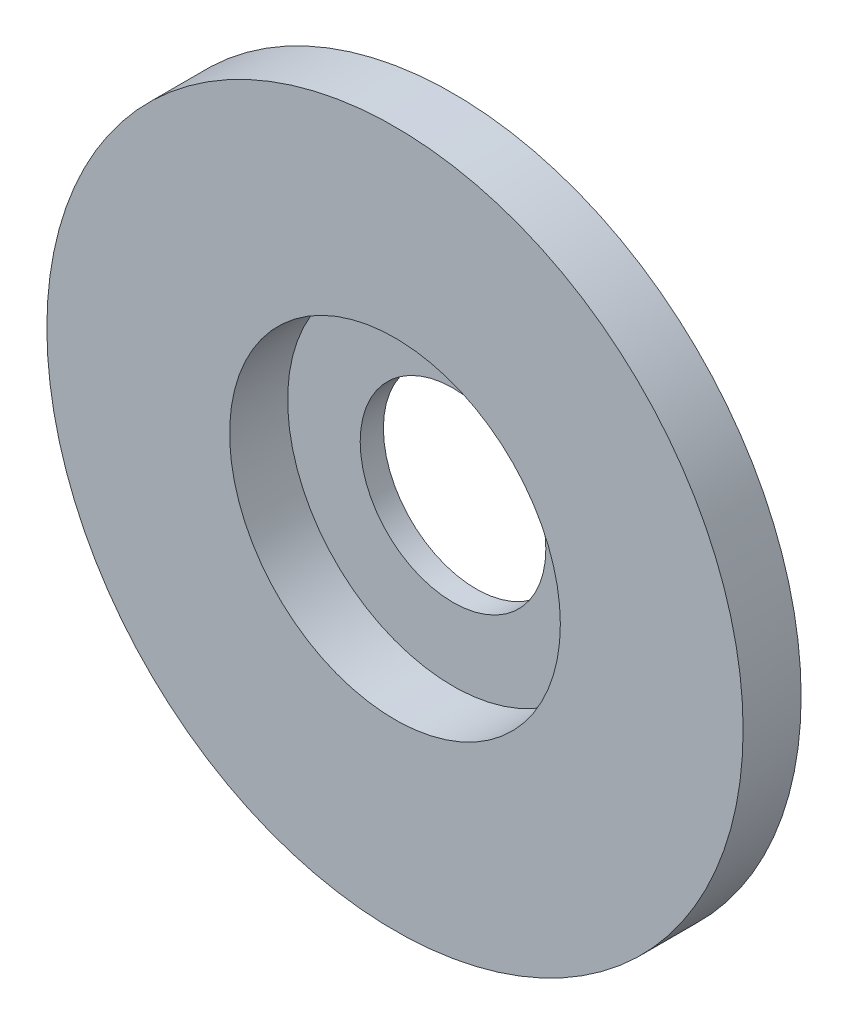
ISO-10303-21;
HEADER;
FILE_DESCRIPTION(('STEP AP214'),'2;1');
FILE_NAME('part.step','',(''),(''),'','','');
FILE_SCHEMA(('AUTOMOTIVE_DESIGN { 1 0 10303 214 1 1 1 1 }'));
ENDSEC;
DATA;
#1=APPLICATION_CONTEXT('core data for automotive mechanical design processes');
#2=APPLICATION_PROTOCOL_DEFINITION('international standard','automotive_design',2000,#1);
#3=PRODUCT_CONTEXT('',#1,'mechanical');
#4=PRODUCT('Part','Part','',(#3));
#5=PRODUCT_RELATED_PRODUCT_CATEGORY('part','',(#4));
#6=PRODUCT_DEFINITION_FORMATION('','',#4);
#7=PRODUCT_DEFINITION_CONTEXT('part definition',#1,'design');
#8=PRODUCT_DEFINITION('design','',#6,#7);
#9=PRODUCT_DEFINITION_SHAPE('','',#8);
#10=(LENGTH_UNIT() NAMED_UNIT(*) SI_UNIT(.MILLI.,.METRE.));
#11=(NAMED_UNIT(*) PLANE_ANGLE_UNIT() SI_UNIT($,.RADIAN.));
#12=(NAMED_UNIT(*) SI_UNIT($,.STERADIAN.) SOLID_ANGLE_UNIT());
#13=UNCERTAINTY_MEASURE_WITH_UNIT(LENGTH_MEASURE(1.E-05),#10,'distance_accuracy_value','');
#14=(GEOMETRIC_REPRESENTATION_CONTEXT(3) GLOBAL_UNCERTAINTY_ASSIGNED_CONTEXT((#13)) GLOBAL_UNIT_ASSIGNED_CONTEXT((#10,
#11,#12)) REPRESENTATION_CONTEXT('',''));
#15=CARTESIAN_POINT('',(0.,0.,0.));
#16=DIRECTION('',(0.,0.,1.));
#17=DIRECTION('',(1.,0.,0.));
#18=AXIS2_PLACEMENT_3D('',#15,#16,#17);
#19=CARTESIAN_POINT('',(0.,0.,2.));
#20=DIRECTION('',(0.,0.,-1.));
#21=DIRECTION('',(-1.,0.,0.));
#22=AXIS2_PLACEMENT_3D('',#19,#20,#21);
#23=CYLINDRICAL_SURFACE('',#22,30.);
#24=CARTESIAN_POINT('',(0.,0.,6.));
#25=DIRECTION('',(0.,0.,1.));
#26=DIRECTION('',(1.,0.,0.));
#27=AXIS2_PLACEMENT_3D('',#24,#25,#26);
#28=CIRCLE('',#27,30.);
#29=CARTESIAN_POINT('',(30.,0.,6.));
#30=VERTEX_POINT('',#29);
#31=EDGE_CURVE('E40',#30,#30,#28,.T.);
#32=ORIENTED_EDGE('',*,*,#31,.F.);
#33=EDGE_LOOP('',(#32));
#34=FACE_BOUND('',#33,.T.);
#35=CARTESIAN_POINT('',(0.,0.,1.));
#36=DIRECTION('',(0.,0.,-1.));
#37=DIRECTION('',(-1.,0.,0.));
#38=AXIS2_PLACEMENT_3D('',#35,#36,#37);
#39=CIRCLE('',#38,30.);
#40=CARTESIAN_POINT('',(-30.,0.,1.));
#41=VERTEX_POINT('',#40);
#42=EDGE_CURVE('E55',#41,#41,#39,.T.);
#43=ORIENTED_EDGE('',*,*,#42,.F.);
#44=EDGE_LOOP('',(#43));
#45=FACE_BOUND('',#44,.T.);
#46=ADVANCED_FACE('F30',(#34,#45),#23,.T.);
#47=CARTESIAN_POINT('',(0.,0.,7.));
#48=DIRECTION('',(0.,0.,-1.));
#49=DIRECTION('',(-1.,0.,0.));
#50=AXIS2_PLACEMENT_3D('',#47,#48,#49);
#51=CYLINDRICAL_SURFACE('',#50,14.25);
#52=CARTESIAN_POINT('',(0.,0.,1.));
#53=DIRECTION('',(0.,0.,1.));
#54=DIRECTION('',(1.,0.,0.));
#55=AXIS2_PLACEMENT_3D('',#52,#53,#54);
#56=CIRCLE('',#55,14.25);
#57=CARTESIAN_POINT('',(14.25,0.,1.));
#58=VERTEX_POINT('',#57);
#59=EDGE_CURVE('E10',#58,#58,#56,.T.);
#60=ORIENTED_EDGE('',*,*,#59,.F.);
#61=EDGE_LOOP('',(#60));
#62=FACE_BOUND('',#61,.T.);
#63=CARTESIAN_POINT('',(0.,0.,6.));
#64=DIRECTION('',(0.,0.,1.));
#65=DIRECTION('',(1.,0.,0.));
#66=AXIS2_PLACEMENT_3D('',#63,#64,#65);
#67=CIRCLE('',#66,14.25);
#68=CARTESIAN_POINT('',(14.25,0.,6.));
#69=VERTEX_POINT('',#68);
#70=EDGE_CURVE('E44',#69,#69,#67,.T.);
#71=ORIENTED_EDGE('',*,*,#70,.T.);
#72=EDGE_LOOP('',(#71));
#73=FACE_BOUND('',#72,.T.);
#74=ADVANCED_FACE('F71',(#62,#73),#51,.F.);
#75=CARTESIAN_POINT('',(0.,0.,2.));
#76=DIRECTION('',(0.,0.,-1.));
#77=DIRECTION('',(-1.,0.,0.));
#78=AXIS2_PLACEMENT_3D('',#75,#76,#77);
#79=CYLINDRICAL_SURFACE('',#78,8.);
#80=CARTESIAN_POINT('',(0.,0.,1.));
#81=DIRECTION('',(0.,0.,1.));
#82=DIRECTION('',(1.,0.,0.));
#83=AXIS2_PLACEMENT_3D('',#80,#81,#82);
#84=CIRCLE('',#83,8.);
#85=CARTESIAN_POINT('',(8.,0.,1.));
#86=VERTEX_POINT('',#85);
#87=EDGE_CURVE('E36',#86,#86,#84,.T.);
#88=ORIENTED_EDGE('',*,*,#87,.T.);
#89=EDGE_LOOP('',(#88));
#90=FACE_BOUND('',#89,.T.);
#91=CARTESIAN_POINT('',(0.,0.,-1.));
#92=DIRECTION('',(0.,0.,-1.));
#93=DIRECTION('',(-1.,0.,0.));
#94=AXIS2_PLACEMENT_3D('',#91,#92,#93);
#95=CIRCLE('',#94,8.);
#96=CARTESIAN_POINT('',(-8.,0.,-1.));
#97=VERTEX_POINT('',#96);
#98=EDGE_CURVE('E52',#97,#97,#95,.T.);
#99=ORIENTED_EDGE('',*,*,#98,.T.);
#100=EDGE_LOOP('',(#99));
#101=FACE_BOUND('',#100,.T.);
#102=ADVANCED_FACE('F76',(#90,#101),#79,.F.);
#103=CARTESIAN_POINT('',(0.,0.,1.));
#104=DIRECTION('',(0.,0.,1.));
#105=DIRECTION('',(1.,0.,0.));
#106=AXIS2_PLACEMENT_3D('',#103,#104,#105);
#107=PLANE('',#106);
#108=ORIENTED_EDGE('',*,*,#87,.F.);
#109=EDGE_LOOP('',(#108));
#110=FACE_BOUND('',#109,.T.);
#111=ORIENTED_EDGE('',*,*,#59,.T.);
#112=EDGE_LOOP('',(#111));
#113=FACE_BOUND('',#112,.T.);
#114=ADVANCED_FACE('F84',(#110,#113),#107,.T.);
#115=CARTESIAN_POINT('',(0.,0.,6.));
#116=DIRECTION('',(0.,0.,1.));
#117=DIRECTION('',(1.,0.,0.));
#118=AXIS2_PLACEMENT_3D('',#115,#116,#117);
#119=PLANE('',#118);
#120=ORIENTED_EDGE('',*,*,#70,.F.);
#121=EDGE_LOOP('',(#120));
#122=FACE_BOUND('',#121,.T.);
#123=ORIENTED_EDGE('',*,*,#31,.T.);
#124=EDGE_LOOP('',(#123));
#125=FACE_BOUND('',#124,.T.);
#126=ADVANCED_FACE('F81',(#122,#125),#119,.T.);
#127=CARTESIAN_POINT('',(0.,0.,-1.));
#128=DIRECTION('',(0.,0.,-1.));
#129=DIRECTION('',(-1.,0.,0.));
#130=AXIS2_PLACEMENT_3D('',#127,#128,#129);
#131=PLANE('',#130);
#132=CARTESIAN_POINT('',(0.,0.,-1.));
#133=DIRECTION('',(0.,0.,-1.));
#134=DIRECTION('',(-1.,0.,0.));
#135=AXIS2_PLACEMENT_3D('',#132,#133,#134);
#136=CIRCLE('',#135,20.);
#137=CARTESIAN_POINT('',(-20.,0.,-1.));
#138=VERTEX_POINT('',#137);
#139=EDGE_CURVE('E49',#138,#138,#136,.T.);
#140=ORIENTED_EDGE('',*,*,#139,.T.);
#141=EDGE_LOOP('',(#140));
#142=FACE_BOUND('',#141,.T.);
#143=ORIENTED_EDGE('',*,*,#98,.F.);
#144=EDGE_LOOP('',(#143));
#145=FACE_BOUND('',#144,.T.);
#146=ADVANCED_FACE('F83',(#142,#145),#131,.T.);
#147=CARTESIAN_POINT('',(0.,0.,-1.));
#148=DIRECTION('',(0.,0.,1.));
#149=DIRECTION('',(1.,0.,0.));
#150=AXIS2_PLACEMENT_3D('',#147,#148,#149);
#151=CYLINDRICAL_SURFACE('',#150,20.);
#152=ORIENTED_EDGE('',*,*,#139,.F.);
#153=EDGE_LOOP('',(#152));
#154=FACE_BOUND('',#153,.T.);
#155=CARTESIAN_POINT('',(0.,0.,1.));
#156=DIRECTION('',(0.,0.,-1.));
#157=DIRECTION('',(-1.,0.,0.));
#158=AXIS2_PLACEMENT_3D('',#155,#156,#157);
#159=CIRCLE('',#158,20.);
#160=CARTESIAN_POINT('',(-20.,0.,1.));
#161=VERTEX_POINT('',#160);
#162=EDGE_CURVE('E58',#161,#161,#159,.T.);
#163=ORIENTED_EDGE('',*,*,#162,.T.);
#164=EDGE_LOOP('',(#163));
#165=FACE_BOUND('',#164,.T.);
#166=ADVANCED_FACE('F62',(#154,#165),#151,.T.);
#167=CARTESIAN_POINT('',(0.,0.,1.));
#168=DIRECTION('',(0.,0.,-1.));
#169=DIRECTION('',(-1.,0.,0.));
#170=AXIS2_PLACEMENT_3D('',#167,#168,#169);
#171=PLANE('',#170);
#172=ORIENTED_EDGE('',*,*,#162,.F.);
#173=EDGE_LOOP('',(#172));
#174=FACE_BOUND('',#173,.T.);
#175=ORIENTED_EDGE('',*,*,#42,.T.);
#176=EDGE_LOOP('',(#175));
#177=FACE_BOUND('',#176,.T.);
#178=ADVANCED_FACE('F64',(#174,#177),#171,.T.);
#179=CLOSED_SHELL('',(#46,#74,#102,#114,#126,#146,#166,#178));
#180=MANIFOLD_SOLID_BREP('B2',#179);
#181=ADVANCED_BREP_SHAPE_REPRESENTATION('',(#18,#180),#14);
#182=SHAPE_DEFINITION_REPRESENTATION(#9,#181);
ENDSEC;
END-ISO-10303-21;
